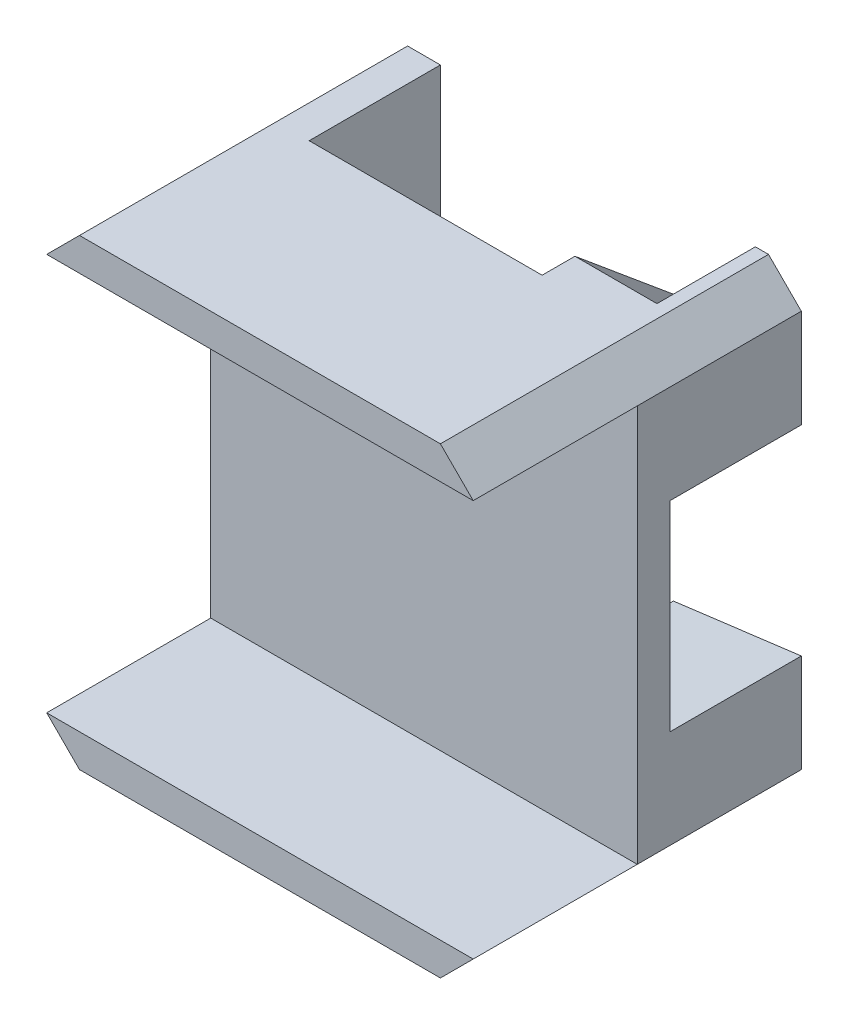
ISO-10303-21;
HEADER;
FILE_DESCRIPTION(('STEP AP214'),'2;1');
FILE_NAME('part.step','',(''),(''),'','','');
FILE_SCHEMA(('AUTOMOTIVE_DESIGN { 1 0 10303 214 1 1 1 1 }'));
ENDSEC;
DATA;
#1=APPLICATION_CONTEXT('core data for automotive mechanical design processes');
#2=APPLICATION_PROTOCOL_DEFINITION('international standard','automotive_design',2000,#1);
#3=PRODUCT_CONTEXT('',#1,'mechanical');
#4=PRODUCT('Part','Part','',(#3));
#5=PRODUCT_RELATED_PRODUCT_CATEGORY('part','',(#4));
#6=PRODUCT_DEFINITION_FORMATION('','',#4);
#7=PRODUCT_DEFINITION_CONTEXT('part definition',#1,'design');
#8=PRODUCT_DEFINITION('design','',#6,#7);
#9=PRODUCT_DEFINITION_SHAPE('','',#8);
#10=(LENGTH_UNIT() NAMED_UNIT(*) SI_UNIT(.MILLI.,.METRE.));
#11=(NAMED_UNIT(*) PLANE_ANGLE_UNIT() SI_UNIT($,.RADIAN.));
#12=(NAMED_UNIT(*) SI_UNIT($,.STERADIAN.) SOLID_ANGLE_UNIT());
#13=UNCERTAINTY_MEASURE_WITH_UNIT(LENGTH_MEASURE(1.E-05),#10,'distance_accuracy_value','');
#14=(GEOMETRIC_REPRESENTATION_CONTEXT(3) GLOBAL_UNCERTAINTY_ASSIGNED_CONTEXT((#13)) GLOBAL_UNIT_ASSIGNED_CONTEXT((#10,
#11,#12)) REPRESENTATION_CONTEXT('',''));
#15=CARTESIAN_POINT('',(0.,0.,0.));
#16=DIRECTION('',(0.,0.,1.));
#17=DIRECTION('',(1.,0.,0.));
#18=AXIS2_PLACEMENT_3D('',#15,#16,#17);
#19=CARTESIAN_POINT('',(0.,0.,0.));
#20=DIRECTION('',(0.,0.,1.));
#21=DIRECTION('',(1.,0.,0.));
#22=AXIS2_PLACEMENT_3D('',#19,#20,#21);
#23=PLANE('',#22);
#24=DIRECTION('',(-0.991881664685851,0.127164315985366,0.));
#25=VECTOR('',#24,1.);
#26=CARTESIAN_POINT('',(2.6,3.55,0.));
#27=LINE('',#26,#25);
#28=CARTESIAN_POINT('',(6.5,3.05,0.));
#29=VERTEX_POINT('',#28);
#30=CARTESIAN_POINT('',(2.6,3.55,0.));
#31=VERTEX_POINT('',#30);
#32=EDGE_CURVE('E215',#29,#31,#27,.T.);
#33=ORIENTED_EDGE('',*,*,#32,.F.);
#34=DIRECTION('',(0.,1.,0.));
#35=VECTOR('',#34,1.);
#36=CARTESIAN_POINT('',(6.5,0.,0.));
#37=LINE('',#36,#35);
#38=CARTESIAN_POINT('',(6.5,-3.05,0.));
#39=VERTEX_POINT('',#38);
#40=EDGE_CURVE('E305',#39,#29,#37,.T.);
#41=ORIENTED_EDGE('',*,*,#40,.F.);
#42=DIRECTION('',(0.991881664685851,0.127164315985365,0.));
#43=VECTOR('',#42,1.);
#44=CARTESIAN_POINT('',(6.5,-3.05,0.));
#45=LINE('',#44,#43);
#46=CARTESIAN_POINT('',(2.6,-3.55,0.));
#47=VERTEX_POINT('',#46);
#48=EDGE_CURVE('E242',#47,#39,#45,.T.);
#49=ORIENTED_EDGE('',*,*,#48,.F.);
#50=DIRECTION('',(0.,1.,0.));
#51=VECTOR('',#50,1.);
#52=CARTESIAN_POINT('',(2.6,-3.55,0.));
#53=LINE('',#52,#51);
#54=CARTESIAN_POINT('',(2.6,-7.05,0.));
#55=VERTEX_POINT('',#54);
#56=EDGE_CURVE('E237',#55,#47,#53,.T.);
#57=ORIENTED_EDGE('',*,*,#56,.F.);
#58=DIRECTION('',(1.,0.,0.));
#59=VECTOR('',#58,1.);
#60=CARTESIAN_POINT('',(0.,-7.05,0.));
#61=LINE('',#60,#59);
#62=CARTESIAN_POINT('',(-4.5,-7.05,0.));
#63=VERTEX_POINT('',#62);
#64=EDGE_CURVE('E278',#63,#55,#61,.T.);
#65=ORIENTED_EDGE('',*,*,#64,.F.);
#66=DIRECTION('',(0.,-1.,0.));
#67=VECTOR('',#66,1.);
#68=CARTESIAN_POINT('',(-4.5,7.05,0.));
#69=LINE('',#68,#67);
#70=CARTESIAN_POINT('',(-4.5,7.05,0.));
#71=VERTEX_POINT('',#70);
#72=EDGE_CURVE('E259',#71,#63,#69,.T.);
#73=ORIENTED_EDGE('',*,*,#72,.F.);
#74=DIRECTION('',(1.,0.,0.));
#75=VECTOR('',#74,1.);
#76=CARTESIAN_POINT('',(0.,7.05,0.));
#77=LINE('',#76,#75);
#78=CARTESIAN_POINT('',(2.6,7.05,0.));
#79=VERTEX_POINT('',#78);
#80=EDGE_CURVE('E309',#71,#79,#77,.T.);
#81=ORIENTED_EDGE('',*,*,#80,.T.);
#82=DIRECTION('',(0.,1.,0.));
#83=VECTOR('',#82,1.);
#84=CARTESIAN_POINT('',(2.6,7.05,0.));
#85=LINE('',#84,#83);
#86=EDGE_CURVE('E220',#31,#79,#85,.T.);
#87=ORIENTED_EDGE('',*,*,#86,.F.);
#88=EDGE_LOOP('',(#33,#41,#49,#57,#65,#73,#81,#87));
#89=FACE_BOUND('',#88,.T.);
#90=ADVANCED_FACE('F35',(#89),#23,.F.);
#91=CARTESIAN_POINT('',(-6.5,0.,6.));
#92=DIRECTION('',(-1.,0.,0.));
#93=DIRECTION('',(0.,0.,1.));
#94=AXIS2_PLACEMENT_3D('',#91,#92,#93);
#95=PLANE('',#94);
#96=DIRECTION('',(0.,1.,0.));
#97=VECTOR('',#96,1.);
#98=CARTESIAN_POINT('',(-6.5,7.05,-4.));
#99=LINE('',#98,#97);
#100=CARTESIAN_POINT('',(-6.5,-6.05,-4.));
#101=VERTEX_POINT('',#100);
#102=CARTESIAN_POINT('',(-6.5,6.05,-4.));
#103=VERTEX_POINT('',#102);
#104=EDGE_CURVE('E260',#101,#103,#99,.T.);
#105=ORIENTED_EDGE('',*,*,#104,.F.);
#106=DIRECTION('',(0.,0.,1.));
#107=VECTOR('',#106,1.);
#108=CARTESIAN_POINT('',(-6.5,-6.05,6.));
#109=LINE('',#108,#107);
#110=CARTESIAN_POINT('',(-6.5,-6.05,1.));
#111=VERTEX_POINT('',#110);
#112=EDGE_CURVE('E333',#101,#111,#109,.T.);
#113=ORIENTED_EDGE('',*,*,#112,.T.);
#114=DIRECTION('',(0.,1.,0.));
#115=VECTOR('',#114,1.);
#116=CARTESIAN_POINT('',(-6.5,0.,1.));
#117=LINE('',#116,#115);
#118=CARTESIAN_POINT('',(-6.5,6.05,1.));
#119=VERTEX_POINT('',#118);
#120=EDGE_CURVE('E296',#111,#119,#117,.T.);
#121=ORIENTED_EDGE('',*,*,#120,.T.);
#122=DIRECTION('',(0.,0.,-1.));
#123=VECTOR('',#122,1.);
#124=CARTESIAN_POINT('',(-6.5,6.05,6.));
#125=LINE('',#124,#123);
#126=EDGE_CURVE('E331',#119,#103,#125,.T.);
#127=ORIENTED_EDGE('',*,*,#126,.T.);
#128=EDGE_LOOP('',(#105,#113,#121,#127));
#129=FACE_BOUND('',#128,.T.);
#130=ADVANCED_FACE('F372',(#129),#95,.T.);
#131=CARTESIAN_POINT('',(0.,6.05,6.));
#132=DIRECTION('',(0.,1.,0.));
#133=DIRECTION('',(0.,0.,1.));
#134=AXIS2_PLACEMENT_3D('',#131,#132,#133);
#135=PLANE('',#134);
#136=DIRECTION('',(0.,0.,-1.));
#137=VECTOR('',#136,1.);
#138=CARTESIAN_POINT('',(-6.5,6.05,6.));
#139=LINE('',#138,#137);
#140=CARTESIAN_POINT('',(-6.5,6.05,6.));
#141=VERTEX_POINT('',#140);
#142=EDGE_CURVE('E319',#141,#119,#139,.T.);
#143=ORIENTED_EDGE('',*,*,#142,.T.);
#144=DIRECTION('',(1.,0.,0.));
#145=VECTOR('',#144,1.);
#146=CARTESIAN_POINT('',(0.,6.05,1.));
#147=LINE('',#146,#145);
#148=CARTESIAN_POINT('',(6.5,6.05,1.));
#149=VERTEX_POINT('',#148);
#150=EDGE_CURVE('E293',#119,#149,#147,.T.);
#151=ORIENTED_EDGE('',*,*,#150,.T.);
#152=DIRECTION('',(0.,0.,-1.));
#153=VECTOR('',#152,1.);
#154=CARTESIAN_POINT('',(6.5,6.05,6.));
#155=LINE('',#154,#153);
#156=CARTESIAN_POINT('',(6.5,6.05,6.));
#157=VERTEX_POINT('',#156);
#158=EDGE_CURVE('E312',#157,#149,#155,.T.);
#159=ORIENTED_EDGE('',*,*,#158,.F.);
#160=DIRECTION('',(1.,0.,0.));
#161=VECTOR('',#160,1.);
#162=CARTESIAN_POINT('',(0.,6.05,6.));
#163=LINE('',#162,#161);
#164=EDGE_CURVE('E306',#141,#157,#163,.T.);
#165=ORIENTED_EDGE('',*,*,#164,.F.);
#166=EDGE_LOOP('',(#143,#151,#159,#165));
#167=FACE_BOUND('',#166,.T.);
#168=ADVANCED_FACE('F361',(#167),#135,.F.);
#169=CARTESIAN_POINT('',(6.5,0.,6.));
#170=DIRECTION('',(-1.,0.,0.));
#171=DIRECTION('',(0.,0.,1.));
#172=AXIS2_PLACEMENT_3D('',#169,#170,#171);
#173=PLANE('',#172);
#174=DIRECTION('',(0.,1.,0.));
#175=VECTOR('',#174,1.);
#176=CARTESIAN_POINT('',(6.5,0.,1.));
#177=LINE('',#176,#175);
#178=CARTESIAN_POINT('',(6.5,-6.05,1.));
#179=VERTEX_POINT('',#178);
#180=EDGE_CURVE('E302',#179,#149,#177,.T.);
#181=ORIENTED_EDGE('',*,*,#180,.F.);
#182=DIRECTION('',(0.,0.,-1.));
#183=VECTOR('',#182,1.);
#184=CARTESIAN_POINT('',(6.5,-6.05,6.));
#185=LINE('',#184,#183);
#186=CARTESIAN_POINT('',(6.5,-6.05,-4.));
#187=VERTEX_POINT('',#186);
#188=EDGE_CURVE('E341',#179,#187,#185,.T.);
#189=ORIENTED_EDGE('',*,*,#188,.T.);
#190=DIRECTION('',(0.,-1.,0.));
#191=VECTOR('',#190,1.);
#192=CARTESIAN_POINT('',(6.5,-7.05,-4.));
#193=LINE('',#192,#191);
#194=CARTESIAN_POINT('',(6.5,-3.05,-4.));
#195=VERTEX_POINT('',#194);
#196=EDGE_CURVE('E238',#195,#187,#193,.T.);
#197=ORIENTED_EDGE('',*,*,#196,.F.);
#198=DIRECTION('',(0.,0.,1.));
#199=VECTOR('',#198,1.);
#200=CARTESIAN_POINT('',(6.5,-3.05,-4.));
#201=LINE('',#200,#199);
#202=EDGE_CURVE('E249',#195,#39,#201,.T.);
#203=ORIENTED_EDGE('',*,*,#202,.T.);
#204=ORIENTED_EDGE('',*,*,#40,.T.);
#205=DIRECTION('',(0.,0.,1.));
#206=VECTOR('',#205,1.);
#207=CARTESIAN_POINT('',(6.5,3.05,-4.));
#208=LINE('',#207,#206);
#209=CARTESIAN_POINT('',(6.5,3.05,-4.));
#210=VERTEX_POINT('',#209);
#211=EDGE_CURVE('E234',#210,#29,#208,.T.);
#212=ORIENTED_EDGE('',*,*,#211,.F.);
#213=DIRECTION('',(0.,-1.,0.));
#214=VECTOR('',#213,1.);
#215=CARTESIAN_POINT('',(6.5,3.05,-4.));
#216=LINE('',#215,#214);
#217=CARTESIAN_POINT('',(6.5,6.05,-4.));
#218=VERTEX_POINT('',#217);
#219=EDGE_CURVE('E217',#218,#210,#216,.T.);
#220=ORIENTED_EDGE('',*,*,#219,.F.);
#221=DIRECTION('',(0.,0.,1.));
#222=VECTOR('',#221,1.);
#223=CARTESIAN_POINT('',(6.5,6.05,6.));
#224=LINE('',#223,#222);
#225=EDGE_CURVE('E339',#218,#149,#224,.T.);
#226=ORIENTED_EDGE('',*,*,#225,.T.);
#227=EDGE_LOOP('',(#181,#189,#197,#203,#204,#212,#220,#226));
#228=FACE_BOUND('',#227,.T.);
#229=ADVANCED_FACE('F381',(#228),#173,.F.);
#230=CARTESIAN_POINT('',(0.,7.05,6.));
#231=DIRECTION('',(0.,1.,0.));
#232=DIRECTION('',(0.,0.,1.));
#233=AXIS2_PLACEMENT_3D('',#230,#231,#232);
#234=PLANE('',#233);
#235=DIRECTION('',(-1.,0.,0.));
#236=VECTOR('',#235,1.);
#237=CARTESIAN_POINT('',(5.1,7.05,-1.));
#238=LINE('',#237,#236);
#239=CARTESIAN_POINT('',(5.1,7.05,-1.));
#240=VERTEX_POINT('',#239);
#241=CARTESIAN_POINT('',(2.6,7.05,-1.));
#242=VERTEX_POINT('',#241);
#243=EDGE_CURVE('E194',#240,#242,#238,.T.);
#244=ORIENTED_EDGE('',*,*,#243,.T.);
#245=DIRECTION('',(0.,0.,1.));
#246=VECTOR('',#245,1.);
#247=CARTESIAN_POINT('',(2.6,7.05,-4.));
#248=LINE('',#247,#246);
#249=EDGE_CURVE('E225',#242,#79,#248,.T.);
#250=ORIENTED_EDGE('',*,*,#249,.T.);
#251=ORIENTED_EDGE('',*,*,#80,.F.);
#252=DIRECTION('',(0.,0.,1.));
#253=VECTOR('',#252,1.);
#254=CARTESIAN_POINT('',(-4.5,7.05,-4.));
#255=LINE('',#254,#253);
#256=CARTESIAN_POINT('',(-4.5,7.05,-4.));
#257=VERTEX_POINT('',#256);
#258=EDGE_CURVE('E275',#257,#71,#255,.T.);
#259=ORIENTED_EDGE('',*,*,#258,.F.);
#260=DIRECTION('',(1.,0.,0.));
#261=VECTOR('',#260,1.);
#262=CARTESIAN_POINT('',(-6.5,7.05,-4.));
#263=LINE('',#262,#261);
#264=CARTESIAN_POINT('',(-5.5,7.05,-4.));
#265=VERTEX_POINT('',#264);
#266=EDGE_CURVE('E263',#265,#257,#263,.T.);
#267=ORIENTED_EDGE('',*,*,#266,.F.);
#268=DIRECTION('',(0.,0.,1.));
#269=VECTOR('',#268,1.);
#270=CARTESIAN_POINT('',(-5.5,7.05,6.));
#271=LINE('',#270,#269);
#272=CARTESIAN_POINT('',(-5.5,7.05,6.));
#273=VERTEX_POINT('',#272);
#274=EDGE_CURVE('E348',#265,#273,#271,.T.);
#275=ORIENTED_EDGE('',*,*,#274,.T.);
#276=DIRECTION('',(1.,0.,0.));
#277=VECTOR('',#276,1.);
#278=CARTESIAN_POINT('',(0.,7.05,6.));
#279=LINE('',#278,#277);
#280=CARTESIAN_POINT('',(5.5,7.05,6.));
#281=VERTEX_POINT('',#280);
#282=EDGE_CURVE('E308',#273,#281,#279,.T.);
#283=ORIENTED_EDGE('',*,*,#282,.T.);
#284=DIRECTION('',(0.,0.,-1.));
#285=VECTOR('',#284,1.);
#286=CARTESIAN_POINT('',(5.5,7.05,-4.));
#287=LINE('',#286,#285);
#288=CARTESIAN_POINT('',(5.5,7.05,-4.));
#289=VERTEX_POINT('',#288);
#290=EDGE_CURVE('E345',#281,#289,#287,.T.);
#291=ORIENTED_EDGE('',*,*,#290,.T.);
#292=DIRECTION('',(1.,0.,0.));
#293=VECTOR('',#292,1.);
#294=CARTESIAN_POINT('',(6.5,7.05,-4.));
#295=LINE('',#294,#293);
#296=CARTESIAN_POINT('',(5.1,7.05,-4.));
#297=VERTEX_POINT('',#296);
#298=EDGE_CURVE('E223',#297,#289,#295,.T.);
#299=ORIENTED_EDGE('',*,*,#298,.F.);
#300=DIRECTION('',(0.,0.,-1.));
#301=VECTOR('',#300,1.);
#302=CARTESIAN_POINT('',(5.1,7.05,-4.));
#303=LINE('',#302,#301);
#304=EDGE_CURVE('E50',#240,#297,#303,.T.);
#305=ORIENTED_EDGE('',*,*,#304,.F.);
#306=EDGE_LOOP('',(#244,#250,#251,#259,#267,#275,#283,#291,#299,#305));
#307=FACE_BOUND('',#306,.T.);
#308=ADVANCED_FACE('F390',(#307),#234,.T.);
#309=CARTESIAN_POINT('',(0.,0.,6.));
#310=DIRECTION('',(0.,0.,1.));
#311=DIRECTION('',(1.,0.,0.));
#312=AXIS2_PLACEMENT_3D('',#309,#310,#311);
#313=PLANE('',#312);
#314=ORIENTED_EDGE('',*,*,#282,.F.);
#315=DIRECTION('',(0.707106781186548,0.707106781186547,0.));
#316=VECTOR('',#315,1.);
#317=CARTESIAN_POINT('',(-6.27499999999999,6.275,6.));
#318=LINE('',#317,#316);
#319=EDGE_CURVE('E43',#273,#141,#318,.F.);
#320=ORIENTED_EDGE('',*,*,#319,.T.);
#321=ORIENTED_EDGE('',*,*,#164,.T.);
#322=DIRECTION('',(-0.707106781186546,0.707106781186549,0.));
#323=VECTOR('',#322,1.);
#324=CARTESIAN_POINT('',(6.27500000000001,6.27499999999999,6.));
#325=LINE('',#324,#323);
#326=EDGE_CURVE('E350',#157,#281,#325,.T.);
#327=ORIENTED_EDGE('',*,*,#326,.T.);
#328=EDGE_LOOP('',(#314,#320,#321,#327));
#329=FACE_BOUND('',#328,.T.);
#330=ADVANCED_FACE('F355',(#329),#313,.T.);
#331=CARTESIAN_POINT('',(0.,0.,1.));
#332=DIRECTION('',(0.,0.,1.));
#333=DIRECTION('',(1.,0.,0.));
#334=AXIS2_PLACEMENT_3D('',#331,#332,#333);
#335=PLANE('',#334);
#336=ORIENTED_EDGE('',*,*,#150,.F.);
#337=ORIENTED_EDGE('',*,*,#120,.F.);
#338=DIRECTION('',(1.,0.,0.));
#339=VECTOR('',#338,1.);
#340=CARTESIAN_POINT('',(0.,-6.05,1.));
#341=LINE('',#340,#339);
#342=EDGE_CURVE('E299',#111,#179,#341,.T.);
#343=ORIENTED_EDGE('',*,*,#342,.T.);
#344=ORIENTED_EDGE('',*,*,#180,.T.);
#345=EDGE_LOOP('',(#336,#337,#343,#344));
#346=FACE_BOUND('',#345,.T.);
#347=ADVANCED_FACE('F370',(#346),#335,.T.);
#348=CARTESIAN_POINT('',(0.,-6.05,6.));
#349=DIRECTION('',(0.,1.,0.));
#350=DIRECTION('',(0.,0.,1.));
#351=AXIS2_PLACEMENT_3D('',#348,#349,#350);
#352=PLANE('',#351);
#353=ORIENTED_EDGE('',*,*,#342,.F.);
#354=DIRECTION('',(0.,0.,-1.));
#355=VECTOR('',#354,1.);
#356=CARTESIAN_POINT('',(-6.5,-6.05,6.));
#357=LINE('',#356,#355);
#358=CARTESIAN_POINT('',(-6.5,-6.05,6.));
#359=VERTEX_POINT('',#358);
#360=EDGE_CURVE('E290',#359,#111,#357,.T.);
#361=ORIENTED_EDGE('',*,*,#360,.F.);
#362=DIRECTION('',(1.,0.,0.));
#363=VECTOR('',#362,1.);
#364=CARTESIAN_POINT('',(0.,-6.05,6.));
#365=LINE('',#364,#363);
#366=CARTESIAN_POINT('',(6.5,-6.05,6.));
#367=VERTEX_POINT('',#366);
#368=EDGE_CURVE('E279',#359,#367,#365,.T.);
#369=ORIENTED_EDGE('',*,*,#368,.T.);
#370=DIRECTION('',(0.,0.,-1.));
#371=VECTOR('',#370,1.);
#372=CARTESIAN_POINT('',(6.5,-6.05,6.));
#373=LINE('',#372,#371);
#374=EDGE_CURVE('E285',#367,#179,#373,.T.);
#375=ORIENTED_EDGE('',*,*,#374,.T.);
#376=EDGE_LOOP('',(#353,#361,#369,#375));
#377=FACE_BOUND('',#376,.T.);
#378=ADVANCED_FACE('F377',(#377),#352,.T.);
#379=CARTESIAN_POINT('',(0.,-7.05,6.));
#380=DIRECTION('',(0.,1.,0.));
#381=DIRECTION('',(0.,0.,1.));
#382=AXIS2_PLACEMENT_3D('',#379,#380,#381);
#383=PLANE('',#382);
#384=DIRECTION('',(0.,0.,1.));
#385=VECTOR('',#384,1.);
#386=CARTESIAN_POINT('',(2.6,-7.05,-4.));
#387=LINE('',#386,#385);
#388=CARTESIAN_POINT('',(2.6,-7.05,-1.));
#389=VERTEX_POINT('',#388);
#390=EDGE_CURVE('E257',#389,#55,#387,.T.);
#391=ORIENTED_EDGE('',*,*,#390,.F.);
#392=DIRECTION('',(-1.,0.,0.));
#393=VECTOR('',#392,1.);
#394=CARTESIAN_POINT('',(5.1,-7.05,-1.));
#395=LINE('',#394,#393);
#396=CARTESIAN_POINT('',(5.1,-7.05,-1.));
#397=VERTEX_POINT('',#396);
#398=EDGE_CURVE('E210',#397,#389,#395,.T.);
#399=ORIENTED_EDGE('',*,*,#398,.F.);
#400=DIRECTION('',(0.,0.,1.));
#401=VECTOR('',#400,1.);
#402=CARTESIAN_POINT('',(5.1,-7.05,-4.));
#403=LINE('',#402,#401);
#404=CARTESIAN_POINT('',(5.1,-7.05,-4.));
#405=VERTEX_POINT('',#404);
#406=EDGE_CURVE('E205',#405,#397,#403,.T.);
#407=ORIENTED_EDGE('',*,*,#406,.F.);
#408=DIRECTION('',(-1.,0.,0.));
#409=VECTOR('',#408,1.);
#410=CARTESIAN_POINT('',(2.6,-7.05,-4.));
#411=LINE('',#410,#409);
#412=CARTESIAN_POINT('',(5.49999999999999,-7.05,-4.));
#413=VERTEX_POINT('',#412);
#414=EDGE_CURVE('E241',#413,#405,#411,.T.);
#415=ORIENTED_EDGE('',*,*,#414,.F.);
#416=DIRECTION('',(0.,0.,1.));
#417=VECTOR('',#416,1.);
#418=CARTESIAN_POINT('',(5.49999999999999,-7.05,6.));
#419=LINE('',#418,#417);
#420=CARTESIAN_POINT('',(5.49999999999999,-7.05,6.));
#421=VERTEX_POINT('',#420);
#422=EDGE_CURVE('E322',#413,#421,#419,.T.);
#423=ORIENTED_EDGE('',*,*,#422,.T.);
#424=DIRECTION('',(1.,0.,0.));
#425=VECTOR('',#424,1.);
#426=CARTESIAN_POINT('',(0.,-7.05,6.));
#427=LINE('',#426,#425);
#428=CARTESIAN_POINT('',(-5.5,-7.05,6.));
#429=VERTEX_POINT('',#428);
#430=EDGE_CURVE('E282',#429,#421,#427,.T.);
#431=ORIENTED_EDGE('',*,*,#430,.F.);
#432=DIRECTION('',(0.,0.,-1.));
#433=VECTOR('',#432,1.);
#434=CARTESIAN_POINT('',(-5.5,-7.05,-4.));
#435=LINE('',#434,#433);
#436=CARTESIAN_POINT('',(-5.5,-7.05,-4.));
#437=VERTEX_POINT('',#436);
#438=EDGE_CURVE('E324',#429,#437,#435,.T.);
#439=ORIENTED_EDGE('',*,*,#438,.T.);
#440=DIRECTION('',(-1.,0.,0.));
#441=VECTOR('',#440,1.);
#442=CARTESIAN_POINT('',(-6.5,-7.05,-4.));
#443=LINE('',#442,#441);
#444=CARTESIAN_POINT('',(-4.5,-7.05,-4.));
#445=VERTEX_POINT('',#444);
#446=EDGE_CURVE('E267',#445,#437,#443,.T.);
#447=ORIENTED_EDGE('',*,*,#446,.F.);
#448=DIRECTION('',(0.,0.,1.));
#449=VECTOR('',#448,1.);
#450=CARTESIAN_POINT('',(-4.5,-7.05,-4.));
#451=LINE('',#450,#449);
#452=EDGE_CURVE('E270',#445,#63,#451,.T.);
#453=ORIENTED_EDGE('',*,*,#452,.T.);
#454=ORIENTED_EDGE('',*,*,#64,.T.);
#455=EDGE_LOOP('',(#391,#399,#407,#415,#423,#431,#439,#447,#453,#454));
#456=FACE_BOUND('',#455,.T.);
#457=ADVANCED_FACE('F405',(#456),#383,.F.);
#458=CARTESIAN_POINT('',(0.,0.,6.));
#459=DIRECTION('',(0.,0.,1.));
#460=DIRECTION('',(1.,0.,0.));
#461=AXIS2_PLACEMENT_3D('',#458,#459,#460);
#462=PLANE('',#461);
#463=ORIENTED_EDGE('',*,*,#368,.F.);
#464=DIRECTION('',(0.707106781186546,-0.707106781186549,0.));
#465=VECTOR('',#464,1.);
#466=CARTESIAN_POINT('',(-6.27500000000001,-6.27499999999999,6.));
#467=LINE('',#466,#465);
#468=EDGE_CURVE('E337',#359,#429,#467,.T.);
#469=ORIENTED_EDGE('',*,*,#468,.T.);
#470=ORIENTED_EDGE('',*,*,#430,.T.);
#471=DIRECTION('',(-0.707106781186549,-0.707106781186546,0.));
#472=VECTOR('',#471,1.);
#473=CARTESIAN_POINT('',(6.27499999999998,-6.27500000000002,6.));
#474=LINE('',#473,#472);
#475=EDGE_CURVE('E335',#421,#367,#474,.F.);
#476=ORIENTED_EDGE('',*,*,#475,.T.);
#477=EDGE_LOOP('',(#463,#469,#470,#476));
#478=FACE_BOUND('',#477,.T.);
#479=ADVANCED_FACE('F410',(#478),#462,.T.);
#480=CARTESIAN_POINT('',(-4.5,7.05,-4.));
#481=DIRECTION('',(-1.,0.,0.));
#482=DIRECTION('',(0.,-1.,0.));
#483=AXIS2_PLACEMENT_3D('',#480,#481,#482);
#484=PLANE('',#483);
#485=ORIENTED_EDGE('',*,*,#72,.T.);
#486=ORIENTED_EDGE('',*,*,#452,.F.);
#487=DIRECTION('',(0.,-1.,0.));
#488=VECTOR('',#487,1.);
#489=CARTESIAN_POINT('',(-4.5,7.05,-4.));
#490=LINE('',#489,#488);
#491=EDGE_CURVE('E265',#257,#445,#490,.T.);
#492=ORIENTED_EDGE('',*,*,#491,.F.);
#493=ORIENTED_EDGE('',*,*,#258,.T.);
#494=EDGE_LOOP('',(#485,#486,#492,#493));
#495=FACE_BOUND('',#494,.T.);
#496=ADVANCED_FACE('F444',(#495),#484,.F.);
#497=CARTESIAN_POINT('',(0.,0.,-4.));
#498=DIRECTION('',(0.,0.,1.));
#499=DIRECTION('',(1.,0.,0.));
#500=AXIS2_PLACEMENT_3D('',#497,#498,#499);
#501=PLANE('',#500);
#502=ORIENTED_EDGE('',*,*,#446,.T.);
#503=DIRECTION('',(-0.707106781186546,0.707106781186549,0.));
#504=VECTOR('',#503,1.);
#505=CARTESIAN_POINT('',(-5.5,-7.05,-4.));
#506=LINE('',#505,#504);
#507=EDGE_CURVE('E329',#437,#101,#506,.T.);
#508=ORIENTED_EDGE('',*,*,#507,.T.);
#509=ORIENTED_EDGE('',*,*,#104,.T.);
#510=DIRECTION('',(-0.707106781186548,-0.707106781186547,0.));
#511=VECTOR('',#510,1.);
#512=CARTESIAN_POINT('',(-6.5,6.05,-4.));
#513=LINE('',#512,#511);
#514=EDGE_CURVE('E327',#103,#265,#513,.F.);
#515=ORIENTED_EDGE('',*,*,#514,.T.);
#516=ORIENTED_EDGE('',*,*,#266,.T.);
#517=ORIENTED_EDGE('',*,*,#491,.T.);
#518=EDGE_LOOP('',(#502,#508,#509,#515,#516,#517));
#519=FACE_BOUND('',#518,.T.);
#520=ADVANCED_FACE('F396',(#519),#501,.F.);
#521=CARTESIAN_POINT('',(2.6,-3.55,-4.));
#522=DIRECTION('',(1.,0.,0.));
#523=DIRECTION('',(0.,1.,0.));
#524=AXIS2_PLACEMENT_3D('',#521,#522,#523);
#525=PLANE('',#524);
#526=DIRECTION('',(0.,1.,0.));
#527=VECTOR('',#526,1.);
#528=CARTESIAN_POINT('',(2.6,-3.55,-4.));
#529=LINE('',#528,#527);
#530=CARTESIAN_POINT('',(2.6,-4.55,-4.));
#531=VERTEX_POINT('',#530);
#532=CARTESIAN_POINT('',(2.6,-3.55,-4.));
#533=VERTEX_POINT('',#532);
#534=EDGE_CURVE('E245',#531,#533,#529,.T.);
#535=ORIENTED_EDGE('',*,*,#534,.F.);
#536=DIRECTION('',(0.,0.64018439966448,-0.768221279597376));
#537=VECTOR('',#536,1.);
#538=CARTESIAN_POINT('',(2.6,-7.05,-1.));
#539=LINE('',#538,#537);
#540=EDGE_CURVE('E201',#389,#531,#539,.T.);
#541=ORIENTED_EDGE('',*,*,#540,.F.);
#542=ORIENTED_EDGE('',*,*,#390,.T.);
#543=ORIENTED_EDGE('',*,*,#56,.T.);
#544=DIRECTION('',(0.,0.,1.));
#545=VECTOR('',#544,1.);
#546=CARTESIAN_POINT('',(2.6,-3.55,-4.));
#547=LINE('',#546,#545);
#548=EDGE_CURVE('E254',#533,#47,#547,.T.);
#549=ORIENTED_EDGE('',*,*,#548,.F.);
#550=EDGE_LOOP('',(#535,#541,#542,#543,#549));
#551=FACE_BOUND('',#550,.T.);
#552=ADVANCED_FACE('F425',(#551),#525,.F.);
#553=CARTESIAN_POINT('',(6.5,-3.05,-4.));
#554=DIRECTION('',(0.127164315985365,-0.991881664685851,0.));
#555=DIRECTION('',(0.991881664685851,0.127164315985365,0.));
#556=AXIS2_PLACEMENT_3D('',#553,#554,#555);
#557=PLANE('',#556);
#558=ORIENTED_EDGE('',*,*,#48,.T.);
#559=ORIENTED_EDGE('',*,*,#202,.F.);
#560=DIRECTION('',(0.991881664685851,0.127164315985365,0.));
#561=VECTOR('',#560,1.);
#562=CARTESIAN_POINT('',(6.5,-3.05,-4.));
#563=LINE('',#562,#561);
#564=EDGE_CURVE('E247',#533,#195,#563,.T.);
#565=ORIENTED_EDGE('',*,*,#564,.F.);
#566=ORIENTED_EDGE('',*,*,#548,.T.);
#567=EDGE_LOOP('',(#558,#559,#565,#566));
#568=FACE_BOUND('',#567,.T.);
#569=ADVANCED_FACE('F431',(#568),#557,.F.);
#570=CARTESIAN_POINT('',(0.,0.,-4.));
#571=DIRECTION('',(0.,0.,-1.));
#572=DIRECTION('',(-1.,0.,0.));
#573=AXIS2_PLACEMENT_3D('',#570,#571,#572);
#574=PLANE('',#573);
#575=DIRECTION('',(-1.,0.,0.));
#576=VECTOR('',#575,1.);
#577=CARTESIAN_POINT('',(5.1,-4.55,-4.));
#578=LINE('',#577,#576);
#579=CARTESIAN_POINT('',(5.1,-4.55,-4.));
#580=VERTEX_POINT('',#579);
#581=EDGE_CURVE('E212',#580,#531,#578,.T.);
#582=ORIENTED_EDGE('',*,*,#581,.T.);
#583=ORIENTED_EDGE('',*,*,#534,.T.);
#584=ORIENTED_EDGE('',*,*,#564,.T.);
#585=ORIENTED_EDGE('',*,*,#196,.T.);
#586=DIRECTION('',(0.707106781186549,0.707106781186546,0.));
#587=VECTOR('',#586,1.);
#588=CARTESIAN_POINT('',(6.27499999999998,-6.27500000000002,-4.));
#589=LINE('',#588,#587);
#590=EDGE_CURVE('E343',#187,#413,#589,.F.);
#591=ORIENTED_EDGE('',*,*,#590,.T.);
#592=ORIENTED_EDGE('',*,*,#414,.T.);
#593=DIRECTION('',(0.,-1.,0.));
#594=VECTOR('',#593,1.);
#595=CARTESIAN_POINT('',(5.1,-4.55,-4.));
#596=LINE('',#595,#594);
#597=EDGE_CURVE('E208',#580,#405,#596,.T.);
#598=ORIENTED_EDGE('',*,*,#597,.F.);
#599=EDGE_LOOP('',(#582,#583,#584,#585,#591,#592,#598));
#600=FACE_BOUND('',#599,.T.);
#601=ADVANCED_FACE('F415',(#600),#574,.T.);
#602=CARTESIAN_POINT('',(2.6,3.55,-4.));
#603=DIRECTION('',(0.127164315985366,0.991881664685851,0.));
#604=DIRECTION('',(-0.991881664685851,0.127164315985366,0.));
#605=AXIS2_PLACEMENT_3D('',#602,#603,#604);
#606=PLANE('',#605);
#607=ORIENTED_EDGE('',*,*,#32,.T.);
#608=DIRECTION('',(0.,0.,1.));
#609=VECTOR('',#608,1.);
#610=CARTESIAN_POINT('',(2.6,3.55,-4.));
#611=LINE('',#610,#609);
#612=CARTESIAN_POINT('',(2.6,3.55,-4.));
#613=VERTEX_POINT('',#612);
#614=EDGE_CURVE('E231',#613,#31,#611,.T.);
#615=ORIENTED_EDGE('',*,*,#614,.F.);
#616=DIRECTION('',(-0.991881664685851,0.127164315985366,0.));
#617=VECTOR('',#616,1.);
#618=CARTESIAN_POINT('',(2.6,3.55,-4.));
#619=LINE('',#618,#617);
#620=EDGE_CURVE('E219',#210,#613,#619,.T.);
#621=ORIENTED_EDGE('',*,*,#620,.F.);
#622=ORIENTED_EDGE('',*,*,#211,.T.);
#623=EDGE_LOOP('',(#607,#615,#621,#622));
#624=FACE_BOUND('',#623,.T.);
#625=ADVANCED_FACE('F436',(#624),#606,.F.);
#626=CARTESIAN_POINT('',(2.6,7.05,-4.));
#627=DIRECTION('',(1.,0.,0.));
#628=DIRECTION('',(0.,1.,0.));
#629=AXIS2_PLACEMENT_3D('',#626,#627,#628);
#630=PLANE('',#629);
#631=ORIENTED_EDGE('',*,*,#249,.F.);
#632=DIRECTION('',(0.,0.64018439966448,0.768221279597376));
#633=VECTOR('',#632,1.);
#634=CARTESIAN_POINT('',(2.6,7.05,-1.));
#635=LINE('',#634,#633);
#636=CARTESIAN_POINT('',(2.6,4.55,-4.));
#637=VERTEX_POINT('',#636);
#638=EDGE_CURVE('E441',#637,#242,#635,.T.);
#639=ORIENTED_EDGE('',*,*,#638,.F.);
#640=DIRECTION('',(0.,1.,0.));
#641=VECTOR('',#640,1.);
#642=CARTESIAN_POINT('',(2.6,7.05,-4.));
#643=LINE('',#642,#641);
#644=EDGE_CURVE('E199',#613,#637,#643,.T.);
#645=ORIENTED_EDGE('',*,*,#644,.F.);
#646=ORIENTED_EDGE('',*,*,#614,.T.);
#647=ORIENTED_EDGE('',*,*,#86,.T.);
#648=EDGE_LOOP('',(#631,#639,#645,#646,#647));
#649=FACE_BOUND('',#648,.T.);
#650=ADVANCED_FACE('F440',(#649),#630,.F.);
#651=CARTESIAN_POINT('',(0.,0.,-4.));
#652=DIRECTION('',(0.,0.,1.));
#653=DIRECTION('',(1.,0.,0.));
#654=AXIS2_PLACEMENT_3D('',#651,#652,#653);
#655=PLANE('',#654);
#656=ORIENTED_EDGE('',*,*,#644,.T.);
#657=DIRECTION('',(-1.,0.,0.));
#658=VECTOR('',#657,1.);
#659=CARTESIAN_POINT('',(5.1,4.55,-4.));
#660=LINE('',#659,#658);
#661=CARTESIAN_POINT('',(5.1,4.55,-4.));
#662=VERTEX_POINT('',#661);
#663=EDGE_CURVE('E191',#662,#637,#660,.T.);
#664=ORIENTED_EDGE('',*,*,#663,.F.);
#665=DIRECTION('',(0.,-1.,0.));
#666=VECTOR('',#665,1.);
#667=CARTESIAN_POINT('',(5.1,4.55,-4.));
#668=LINE('',#667,#666);
#669=EDGE_CURVE('E181',#297,#662,#668,.T.);
#670=ORIENTED_EDGE('',*,*,#669,.F.);
#671=ORIENTED_EDGE('',*,*,#298,.T.);
#672=DIRECTION('',(0.707106781186546,-0.707106781186549,0.));
#673=VECTOR('',#672,1.);
#674=CARTESIAN_POINT('',(5.5,7.05,-4.));
#675=LINE('',#674,#673);
#676=EDGE_CURVE('E11',#289,#218,#675,.T.);
#677=ORIENTED_EDGE('',*,*,#676,.T.);
#678=ORIENTED_EDGE('',*,*,#219,.T.);
#679=ORIENTED_EDGE('',*,*,#620,.T.);
#680=EDGE_LOOP('',(#656,#664,#670,#671,#677,#678,#679));
#681=FACE_BOUND('',#680,.T.);
#682=ADVANCED_FACE('F197',(#681),#655,.F.);
#683=CARTESIAN_POINT('',(-5.5,-7.05,6.));
#684=DIRECTION('',(-0.707106781186549,-0.707106781186546,0.));
#685=DIRECTION('',(0.,0.,1.));
#686=AXIS2_PLACEMENT_3D('',#683,#684,#685);
#687=PLANE('',#686);
#688=ORIENTED_EDGE('',*,*,#360,.T.);
#689=ORIENTED_EDGE('',*,*,#112,.F.);
#690=ORIENTED_EDGE('',*,*,#507,.F.);
#691=ORIENTED_EDGE('',*,*,#438,.F.);
#692=ORIENTED_EDGE('',*,*,#468,.F.);
#693=EDGE_LOOP('',(#688,#689,#690,#691,#692));
#694=FACE_BOUND('',#693,.T.);
#695=ADVANCED_FACE('F400',(#694),#687,.T.);
#696=CARTESIAN_POINT('',(6.5,-6.05,6.));
#697=DIRECTION('',(-0.707106781186546,0.707106781186549,0.));
#698=DIRECTION('',(0.,0.,-1.));
#699=AXIS2_PLACEMENT_3D('',#696,#697,#698);
#700=PLANE('',#699);
#701=ORIENTED_EDGE('',*,*,#475,.F.);
#702=ORIENTED_EDGE('',*,*,#422,.F.);
#703=ORIENTED_EDGE('',*,*,#590,.F.);
#704=ORIENTED_EDGE('',*,*,#188,.F.);
#705=ORIENTED_EDGE('',*,*,#374,.F.);
#706=EDGE_LOOP('',(#701,#702,#703,#704,#705));
#707=FACE_BOUND('',#706,.T.);
#708=ADVANCED_FACE('F412',(#707),#700,.F.);
#709=CARTESIAN_POINT('',(-6.5,6.05,6.));
#710=DIRECTION('',(0.707106781186547,-0.707106781186548,0.));
#711=DIRECTION('',(0.,0.,-1.));
#712=AXIS2_PLACEMENT_3D('',#709,#710,#711);
#713=PLANE('',#712);
#714=ORIENTED_EDGE('',*,*,#319,.F.);
#715=ORIENTED_EDGE('',*,*,#274,.F.);
#716=ORIENTED_EDGE('',*,*,#514,.F.);
#717=ORIENTED_EDGE('',*,*,#126,.F.);
#718=ORIENTED_EDGE('',*,*,#142,.F.);
#719=EDGE_LOOP('',(#714,#715,#716,#717,#718));
#720=FACE_BOUND('',#719,.T.);
#721=ADVANCED_FACE('F363',(#720),#713,.F.);
#722=CARTESIAN_POINT('',(5.5,7.05,6.));
#723=DIRECTION('',(0.707106781186549,0.707106781186546,0.));
#724=DIRECTION('',(0.,0.,1.));
#725=AXIS2_PLACEMENT_3D('',#722,#723,#724);
#726=PLANE('',#725);
#727=ORIENTED_EDGE('',*,*,#158,.T.);
#728=ORIENTED_EDGE('',*,*,#225,.F.);
#729=ORIENTED_EDGE('',*,*,#676,.F.);
#730=ORIENTED_EDGE('',*,*,#290,.F.);
#731=ORIENTED_EDGE('',*,*,#326,.F.);
#732=EDGE_LOOP('',(#727,#728,#729,#730,#731));
#733=FACE_BOUND('',#732,.T.);
#734=ADVANCED_FACE('F37',(#733),#726,.T.);
#735=CARTESIAN_POINT('',(5.1,-7.05,-1.));
#736=DIRECTION('',(0.,0.768221279597376,0.64018439966448));
#737=DIRECTION('',(0.,-0.64018439966448,0.768221279597376));
#738=AXIS2_PLACEMENT_3D('',#735,#736,#737);
#739=PLANE('',#738);
#740=ORIENTED_EDGE('',*,*,#540,.T.);
#741=ORIENTED_EDGE('',*,*,#581,.F.);
#742=DIRECTION('',(0.,0.64018439966448,-0.768221279597376));
#743=VECTOR('',#742,1.);
#744=CARTESIAN_POINT('',(5.1,-7.05,-1.));
#745=LINE('',#744,#743);
#746=EDGE_CURVE('E58',#397,#580,#745,.T.);
#747=ORIENTED_EDGE('',*,*,#746,.F.);
#748=ORIENTED_EDGE('',*,*,#398,.T.);
#749=EDGE_LOOP('',(#740,#741,#747,#748));
#750=FACE_BOUND('',#749,.T.);
#751=ADVANCED_FACE('F475',(#750),#739,.F.);
#752=CARTESIAN_POINT('',(5.1,0.,0.));
#753=DIRECTION('',(1.,0.,0.));
#754=DIRECTION('',(0.,1.,0.));
#755=AXIS2_PLACEMENT_3D('',#752,#753,#754);
#756=PLANE('',#755);
#757=ORIENTED_EDGE('',*,*,#406,.T.);
#758=ORIENTED_EDGE('',*,*,#746,.T.);
#759=ORIENTED_EDGE('',*,*,#597,.T.);
#760=EDGE_LOOP('',(#757,#758,#759));
#761=FACE_BOUND('',#760,.T.);
#762=ADVANCED_FACE('F419',(#761),#756,.F.);
#763=CARTESIAN_POINT('',(5.1,7.05,-1.));
#764=DIRECTION('',(0.,-0.768221279597376,0.64018439966448));
#765=DIRECTION('',(0.,-0.64018439966448,-0.768221279597376));
#766=AXIS2_PLACEMENT_3D('',#763,#764,#765);
#767=PLANE('',#766);
#768=ORIENTED_EDGE('',*,*,#638,.T.);
#769=ORIENTED_EDGE('',*,*,#243,.F.);
#770=DIRECTION('',(0.,0.64018439966448,0.768221279597376));
#771=VECTOR('',#770,1.);
#772=CARTESIAN_POINT('',(5.1,7.05,-1.));
#773=LINE('',#772,#771);
#774=EDGE_CURVE('E184',#662,#240,#773,.T.);
#775=ORIENTED_EDGE('',*,*,#774,.F.);
#776=ORIENTED_EDGE('',*,*,#663,.T.);
#777=EDGE_LOOP('',(#768,#769,#775,#776));
#778=FACE_BOUND('',#777,.T.);
#779=ADVANCED_FACE('F190',(#778),#767,.F.);
#780=CARTESIAN_POINT('',(5.1,0.,0.));
#781=DIRECTION('',(-1.,0.,0.));
#782=DIRECTION('',(0.,-1.,0.));
#783=AXIS2_PLACEMENT_3D('',#780,#781,#782);
#784=PLANE('',#783);
#785=ORIENTED_EDGE('',*,*,#304,.T.);
#786=ORIENTED_EDGE('',*,*,#669,.T.);
#787=ORIENTED_EDGE('',*,*,#774,.T.);
#788=EDGE_LOOP('',(#785,#786,#787));
#789=FACE_BOUND('',#788,.T.);
#790=ADVANCED_FACE('F183',(#789),#784,.T.);
#791=CLOSED_SHELL('',(#90,#130,#168,#229,#308,#330,#347,#378,#457,#479,#496,#520,#552,#569,#601,
#625,#650,#682,#695,#708,#721,#734,#751,#762,#779,#790));
#792=MANIFOLD_SOLID_BREP('B2',#791);
#793=ADVANCED_BREP_SHAPE_REPRESENTATION('',(#18,#792),#14);
#794=SHAPE_DEFINITION_REPRESENTATION(#9,#793);
ENDSEC;
END-ISO-10303-21;
